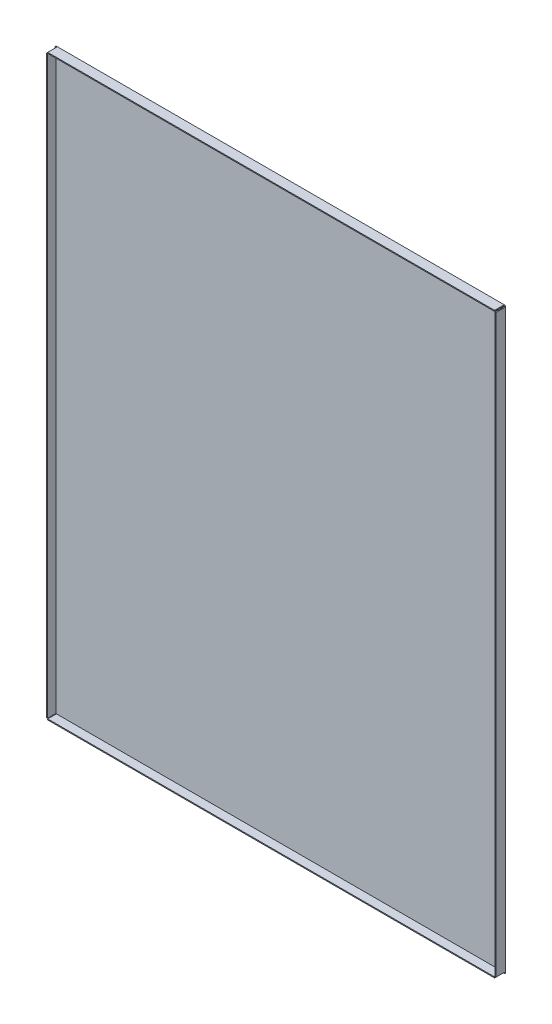
ISO-10303-21;
HEADER;
FILE_DESCRIPTION(('STEP AP214'),'2;1');
FILE_NAME('part.step','',(''),(''),'','','');
FILE_SCHEMA(('AUTOMOTIVE_DESIGN { 1 0 10303 214 1 1 1 1 }'));
ENDSEC;
DATA;
#1=APPLICATION_CONTEXT('core data for automotive mechanical design processes');
#2=APPLICATION_PROTOCOL_DEFINITION('international standard','automotive_design',2000,#1);
#3=PRODUCT_CONTEXT('',#1,'mechanical');
#4=PRODUCT('Part','Part','',(#3));
#5=PRODUCT_RELATED_PRODUCT_CATEGORY('part','',(#4));
#6=PRODUCT_DEFINITION_FORMATION('','',#4);
#7=PRODUCT_DEFINITION_CONTEXT('part definition',#1,'design');
#8=PRODUCT_DEFINITION('design','',#6,#7);
#9=PRODUCT_DEFINITION_SHAPE('','',#8);
#10=(LENGTH_UNIT() NAMED_UNIT(*) SI_UNIT(.MILLI.,.METRE.));
#11=(NAMED_UNIT(*) PLANE_ANGLE_UNIT() SI_UNIT($,.RADIAN.));
#12=(NAMED_UNIT(*) SI_UNIT($,.STERADIAN.) SOLID_ANGLE_UNIT());
#13=UNCERTAINTY_MEASURE_WITH_UNIT(LENGTH_MEASURE(1.E-05),#10,'distance_accuracy_value','');
#14=(GEOMETRIC_REPRESENTATION_CONTEXT(3) GLOBAL_UNCERTAINTY_ASSIGNED_CONTEXT((#13)) GLOBAL_UNIT_ASSIGNED_CONTEXT((#10,
#11,#12)) REPRESENTATION_CONTEXT('',''));
#15=CARTESIAN_POINT('',(0.,0.,0.));
#16=DIRECTION('',(0.,0.,1.));
#17=DIRECTION('',(1.,0.,0.));
#18=AXIS2_PLACEMENT_3D('',#15,#16,#17);
#19=CARTESIAN_POINT('',(0.,0.,15.));
#20=DIRECTION('',(0.,0.,1.));
#21=DIRECTION('',(1.,0.,0.));
#22=AXIS2_PLACEMENT_3D('',#19,#20,#21);
#23=PLANE('',#22);
#24=DIRECTION('',(1.,0.,0.));
#25=VECTOR('',#24,1.);
#26=CARTESIAN_POINT('',(349.,447.,15.));
#27=LINE('',#26,#25);
#28=CARTESIAN_POINT('',(347.5,447.,15.));
#29=VERTEX_POINT('',#28);
#30=CARTESIAN_POINT('',(349.,447.,15.));
#31=VERTEX_POINT('',#30);
#32=EDGE_CURVE('E167',#29,#31,#27,.T.);
#33=ORIENTED_EDGE('',*,*,#32,.F.);
#34=DIRECTION('',(0.,1.,0.));
#35=VECTOR('',#34,1.);
#36=CARTESIAN_POINT('',(347.5,-447.5,15.));
#37=LINE('',#36,#35);
#38=CARTESIAN_POINT('',(347.5,-447.,15.));
#39=VERTEX_POINT('',#38);
#40=EDGE_CURVE('E271',#39,#29,#37,.T.);
#41=ORIENTED_EDGE('',*,*,#40,.F.);
#42=DIRECTION('',(-1.,1.11022302462522E-13,0.));
#43=VECTOR('',#42,1.);
#44=CARTESIAN_POINT('',(349.000000000001,-447.,15.));
#45=LINE('',#44,#43);
#46=CARTESIAN_POINT('',(349.000000000001,-447.,15.));
#47=VERTEX_POINT('',#46);
#48=EDGE_CURVE('E244',#47,#39,#45,.T.);
#49=ORIENTED_EDGE('',*,*,#48,.F.);
#50=DIRECTION('',(0.,-1.,0.));
#51=VECTOR('',#50,1.);
#52=CARTESIAN_POINT('',(349.,-449.,15.));
#53=LINE('',#52,#51);
#54=EDGE_CURVE('E203',#31,#47,#53,.T.);
#55=ORIENTED_EDGE('',*,*,#54,.F.);
#56=EDGE_LOOP('',(#33,#41,#49,#55));
#57=FACE_BOUND('',#56,.T.);
#58=ADVANCED_FACE('F17',(#57),#23,.T.);
#59=DIRECTION('',(-1.,-1.11022302462516E-13,0.));
#60=VECTOR('',#59,1.);
#61=CARTESIAN_POINT('',(-349.,-447.000000000001,15.));
#62=LINE('',#61,#60);
#63=CARTESIAN_POINT('',(-347.5,-447.000000000001,15.));
#64=VERTEX_POINT('',#63);
#65=CARTESIAN_POINT('',(-349.,-447.000000000001,15.));
#66=VERTEX_POINT('',#65);
#67=EDGE_CURVE('E287',#64,#66,#62,.T.);
#68=ORIENTED_EDGE('',*,*,#67,.F.);
#69=DIRECTION('',(0.,-1.,0.));
#70=VECTOR('',#69,1.);
#71=CARTESIAN_POINT('',(-347.5,447.5,15.));
#72=LINE('',#71,#70);
#73=CARTESIAN_POINT('',(-347.5,447.,15.));
#74=VERTEX_POINT('',#73);
#75=EDGE_CURVE('E264',#74,#64,#72,.T.);
#76=ORIENTED_EDGE('',*,*,#75,.F.);
#77=DIRECTION('',(1.,-1.11022302462516E-13,0.));
#78=VECTOR('',#77,1.);
#79=CARTESIAN_POINT('',(-349.,447.,15.));
#80=LINE('',#79,#78);
#81=CARTESIAN_POINT('',(-349.,447.,15.));
#82=VERTEX_POINT('',#81);
#83=EDGE_CURVE('E307',#82,#74,#80,.T.);
#84=ORIENTED_EDGE('',*,*,#83,.F.);
#85=DIRECTION('',(0.,1.,0.));
#86=VECTOR('',#85,1.);
#87=CARTESIAN_POINT('',(-349.,-449.,15.));
#88=LINE('',#87,#86);
#89=EDGE_CURVE('E184',#66,#82,#88,.T.);
#90=ORIENTED_EDGE('',*,*,#89,.F.);
#91=EDGE_LOOP('',(#68,#76,#84,#90));
#92=FACE_BOUND('',#91,.T.);
#93=ADVANCED_FACE('F357',(#92),#23,.T.);
#94=DIRECTION('',(0.,-1.,0.));
#95=VECTOR('',#94,1.);
#96=CARTESIAN_POINT('',(347.,449.,15.));
#97=LINE('',#96,#95);
#98=CARTESIAN_POINT('',(347.,449.,15.));
#99=VERTEX_POINT('',#98);
#100=CARTESIAN_POINT('',(347.,447.5,15.));
#101=VERTEX_POINT('',#100);
#102=EDGE_CURVE('E160',#99,#101,#97,.T.);
#103=ORIENTED_EDGE('',*,*,#102,.F.);
#104=DIRECTION('',(1.,0.,0.));
#105=VECTOR('',#104,1.);
#106=CARTESIAN_POINT('',(349.,449.,15.));
#107=LINE('',#106,#105);
#108=CARTESIAN_POINT('',(-347.,449.,15.));
#109=VERTEX_POINT('',#108);
#110=EDGE_CURVE('E174',#109,#99,#107,.T.);
#111=ORIENTED_EDGE('',*,*,#110,.F.);
#112=DIRECTION('',(0.,1.,0.));
#113=VECTOR('',#112,1.);
#114=CARTESIAN_POINT('',(-347.,449.,15.));
#115=LINE('',#114,#113);
#116=CARTESIAN_POINT('',(-347.,447.5,15.));
#117=VERTEX_POINT('',#116);
#118=EDGE_CURVE('E309',#117,#109,#115,.T.);
#119=ORIENTED_EDGE('',*,*,#118,.F.);
#120=DIRECTION('',(-1.,0.,0.));
#121=VECTOR('',#120,1.);
#122=CARTESIAN_POINT('',(347.5,447.5,15.));
#123=LINE('',#122,#121);
#124=EDGE_CURVE('E176',#101,#117,#123,.T.);
#125=ORIENTED_EDGE('',*,*,#124,.F.);
#126=EDGE_LOOP('',(#103,#111,#119,#125));
#127=FACE_BOUND('',#126,.T.);
#128=ADVANCED_FACE('F172',(#127),#23,.T.);
#129=CARTESIAN_POINT('',(349.,-449.,15.));
#130=DIRECTION('',(1.,0.,0.));
#131=DIRECTION('',(0.,1.,0.));
#132=AXIS2_PLACEMENT_3D('',#129,#130,#131);
#133=PLANE('',#132);
#134=DIRECTION('',(0.,0.,1.));
#135=VECTOR('',#134,1.);
#136=CARTESIAN_POINT('',(349.,447.,-1.32842712474682));
#137=LINE('',#136,#135);
#138=CARTESIAN_POINT('',(349.,447.,1.5));
#139=VERTEX_POINT('',#138);
#140=EDGE_CURVE('E166',#139,#31,#137,.T.);
#141=ORIENTED_EDGE('',*,*,#140,.T.);
#142=ORIENTED_EDGE('',*,*,#54,.T.);
#143=DIRECTION('',(0.,0.,1.));
#144=VECTOR('',#143,1.);
#145=CARTESIAN_POINT('',(349.000000000001,-447.,-1.32842712474682));
#146=LINE('',#145,#144);
#147=CARTESIAN_POINT('',(349.000000000001,-447.,1.5));
#148=VERTEX_POINT('',#147);
#149=EDGE_CURVE('E249',#148,#47,#146,.T.);
#150=ORIENTED_EDGE('',*,*,#149,.F.);
#151=DIRECTION('',(-3.88578058618804E-13,-1.,0.));
#152=VECTOR('',#151,1.);
#153=CARTESIAN_POINT('',(349.,-449.,1.5));
#154=LINE('',#153,#152);
#155=CARTESIAN_POINT('',(349.,-449.,1.5));
#156=VERTEX_POINT('',#155);
#157=EDGE_CURVE('E228',#148,#156,#154,.T.);
#158=ORIENTED_EDGE('',*,*,#157,.T.);
#159=DIRECTION('',(0.,0.,-1.));
#160=VECTOR('',#159,1.);
#161=CARTESIAN_POINT('',(349.,-449.,15.));
#162=LINE('',#161,#160);
#163=CARTESIAN_POINT('',(349.,-449.,0.));
#164=VERTEX_POINT('',#163);
#165=EDGE_CURVE('E21',#156,#164,#162,.T.);
#166=ORIENTED_EDGE('',*,*,#165,.T.);
#167=DIRECTION('',(0.,-1.,0.));
#168=VECTOR('',#167,1.);
#169=CARTESIAN_POINT('',(349.,-449.,0.));
#170=LINE('',#169,#168);
#171=CARTESIAN_POINT('',(349.,449.,0.));
#172=VERTEX_POINT('',#171);
#173=EDGE_CURVE('E192',#172,#164,#170,.T.);
#174=ORIENTED_EDGE('',*,*,#173,.F.);
#175=DIRECTION('',(0.,0.,-1.));
#176=VECTOR('',#175,1.);
#177=CARTESIAN_POINT('',(349.,449.,15.));
#178=LINE('',#177,#176);
#179=CARTESIAN_POINT('',(349.,449.,1.5));
#180=VERTEX_POINT('',#179);
#181=EDGE_CURVE('E11',#180,#172,#178,.T.);
#182=ORIENTED_EDGE('',*,*,#181,.F.);
#183=DIRECTION('',(0.,-1.,0.));
#184=VECTOR('',#183,1.);
#185=CARTESIAN_POINT('',(349.,449.,1.5));
#186=LINE('',#185,#184);
#187=EDGE_CURVE('E345',#180,#139,#186,.T.);
#188=ORIENTED_EDGE('',*,*,#187,.T.);
#189=EDGE_LOOP('',(#141,#142,#150,#158,#166,#174,#182,#188));
#190=FACE_BOUND('',#189,.T.);
#191=ADVANCED_FACE('F19',(#190),#133,.T.);
#192=CARTESIAN_POINT('',(349.,449.,15.));
#193=DIRECTION('',(0.,1.,0.));
#194=DIRECTION('',(-1.,0.,0.));
#195=AXIS2_PLACEMENT_3D('',#192,#193,#194);
#196=PLANE('',#195);
#197=DIRECTION('',(0.,0.,1.));
#198=VECTOR('',#197,1.);
#199=CARTESIAN_POINT('',(347.,449.,-1.32842712474682));
#200=LINE('',#199,#198);
#201=CARTESIAN_POINT('',(347.,449.,1.5));
#202=VERTEX_POINT('',#201);
#203=EDGE_CURVE('E157',#202,#99,#200,.T.);
#204=ORIENTED_EDGE('',*,*,#203,.F.);
#205=DIRECTION('',(1.,0.,0.));
#206=VECTOR('',#205,1.);
#207=CARTESIAN_POINT('',(349.,449.,1.5));
#208=LINE('',#207,#206);
#209=EDGE_CURVE('E318',#202,#180,#208,.T.);
#210=ORIENTED_EDGE('',*,*,#209,.T.);
#211=ORIENTED_EDGE('',*,*,#181,.T.);
#212=DIRECTION('',(1.,0.,0.));
#213=VECTOR('',#212,1.);
#214=CARTESIAN_POINT('',(349.,449.,0.));
#215=LINE('',#214,#213);
#216=CARTESIAN_POINT('',(-349.,449.,0.));
#217=VERTEX_POINT('',#216);
#218=EDGE_CURVE('E201',#217,#172,#215,.T.);
#219=ORIENTED_EDGE('',*,*,#218,.F.);
#220=DIRECTION('',(0.,0.,-1.));
#221=VECTOR('',#220,1.);
#222=CARTESIAN_POINT('',(-349.,449.,15.));
#223=LINE('',#222,#221);
#224=CARTESIAN_POINT('',(-349.,449.,1.5));
#225=VERTEX_POINT('',#224);
#226=EDGE_CURVE('E26',#225,#217,#223,.T.);
#227=ORIENTED_EDGE('',*,*,#226,.F.);
#228=DIRECTION('',(1.,0.,0.));
#229=VECTOR('',#228,1.);
#230=CARTESIAN_POINT('',(-349.,449.,1.5));
#231=LINE('',#230,#229);
#232=CARTESIAN_POINT('',(-347.,449.,1.5));
#233=VERTEX_POINT('',#232);
#234=EDGE_CURVE('E304',#225,#233,#231,.T.);
#235=ORIENTED_EDGE('',*,*,#234,.T.);
#236=DIRECTION('',(0.,0.,1.));
#237=VECTOR('',#236,1.);
#238=CARTESIAN_POINT('',(-347.,449.,-1.32842712474682));
#239=LINE('',#238,#237);
#240=EDGE_CURVE('E183',#233,#109,#239,.T.);
#241=ORIENTED_EDGE('',*,*,#240,.T.);
#242=ORIENTED_EDGE('',*,*,#110,.T.);
#243=EDGE_LOOP('',(#204,#210,#211,#219,#227,#235,#241,#242));
#244=FACE_BOUND('',#243,.T.);
#245=ADVANCED_FACE('F180',(#244),#196,.T.);
#246=CARTESIAN_POINT('',(-349.,-449.,15.));
#247=DIRECTION('',(-1.,0.,0.));
#248=DIRECTION('',(0.,0.,1.));
#249=AXIS2_PLACEMENT_3D('',#246,#247,#248);
#250=PLANE('',#249);
#251=DIRECTION('',(0.,0.,1.));
#252=VECTOR('',#251,1.);
#253=CARTESIAN_POINT('',(-349.,-447.000000000001,-1.32842712474682));
#254=LINE('',#253,#252);
#255=CARTESIAN_POINT('',(-349.,-447.000000000001,1.5));
#256=VERTEX_POINT('',#255);
#257=EDGE_CURVE('E297',#256,#66,#254,.T.);
#258=ORIENTED_EDGE('',*,*,#257,.T.);
#259=ORIENTED_EDGE('',*,*,#89,.T.);
#260=DIRECTION('',(0.,0.,1.));
#261=VECTOR('',#260,1.);
#262=CARTESIAN_POINT('',(-349.,447.,-1.32842712474682));
#263=LINE('',#262,#261);
#264=CARTESIAN_POINT('',(-349.,447.,1.5));
#265=VERTEX_POINT('',#264);
#266=EDGE_CURVE('E311',#265,#82,#263,.T.);
#267=ORIENTED_EDGE('',*,*,#266,.F.);
#268=DIRECTION('',(0.,1.,0.));
#269=VECTOR('',#268,1.);
#270=CARTESIAN_POINT('',(-349.,449.,1.5));
#271=LINE('',#270,#269);
#272=EDGE_CURVE('E291',#265,#225,#271,.T.);
#273=ORIENTED_EDGE('',*,*,#272,.T.);
#274=ORIENTED_EDGE('',*,*,#226,.T.);
#275=DIRECTION('',(0.,1.,0.));
#276=VECTOR('',#275,1.);
#277=CARTESIAN_POINT('',(-349.,-449.,0.));
#278=LINE('',#277,#276);
#279=CARTESIAN_POINT('',(-349.,-449.,0.));
#280=VERTEX_POINT('',#279);
#281=EDGE_CURVE('E198',#280,#217,#278,.T.);
#282=ORIENTED_EDGE('',*,*,#281,.F.);
#283=DIRECTION('',(0.,0.,-1.));
#284=VECTOR('',#283,1.);
#285=CARTESIAN_POINT('',(-349.,-449.,15.));
#286=LINE('',#285,#284);
#287=CARTESIAN_POINT('',(-349.,-449.,1.5));
#288=VERTEX_POINT('',#287);
#289=EDGE_CURVE('E186',#288,#280,#286,.T.);
#290=ORIENTED_EDGE('',*,*,#289,.F.);
#291=DIRECTION('',(3.33066907387732E-13,1.,0.));
#292=VECTOR('',#291,1.);
#293=CARTESIAN_POINT('',(-349.,-449.,1.5));
#294=LINE('',#293,#292);
#295=EDGE_CURVE('E294',#288,#256,#294,.T.);
#296=ORIENTED_EDGE('',*,*,#295,.T.);
#297=EDGE_LOOP('',(#258,#259,#267,#273,#274,#282,#290,#296));
#298=FACE_BOUND('',#297,.T.);
#299=ADVANCED_FACE('F217',(#298),#250,.T.);
#300=CARTESIAN_POINT('',(349.,-449.,15.));
#301=DIRECTION('',(0.,-1.,0.));
#302=DIRECTION('',(0.,0.,-1.));
#303=AXIS2_PLACEMENT_3D('',#300,#301,#302);
#304=PLANE('',#303);
#305=DIRECTION('',(0.,0.,1.));
#306=VECTOR('',#305,1.);
#307=CARTESIAN_POINT('',(-347.,-449.000000000001,-1.32842712474682));
#308=LINE('',#307,#306);
#309=CARTESIAN_POINT('',(-347.,-449.000000000001,1.5));
#310=VERTEX_POINT('',#309);
#311=CARTESIAN_POINT('',(-347.,-449.000000000001,15.));
#312=VERTEX_POINT('',#311);
#313=EDGE_CURVE('E278',#310,#312,#308,.T.);
#314=ORIENTED_EDGE('',*,*,#313,.F.);
#315=DIRECTION('',(-1.,5.55111512312393E-13,0.));
#316=VECTOR('',#315,1.);
#317=CARTESIAN_POINT('',(-349.,-449.,1.5));
#318=LINE('',#317,#316);
#319=EDGE_CURVE('E177',#310,#288,#318,.T.);
#320=ORIENTED_EDGE('',*,*,#319,.T.);
#321=ORIENTED_EDGE('',*,*,#289,.T.);
#322=DIRECTION('',(-1.,0.,0.));
#323=VECTOR('',#322,1.);
#324=CARTESIAN_POINT('',(349.,-449.,0.));
#325=LINE('',#324,#323);
#326=EDGE_CURVE('E195',#164,#280,#325,.T.);
#327=ORIENTED_EDGE('',*,*,#326,.F.);
#328=ORIENTED_EDGE('',*,*,#165,.F.);
#329=DIRECTION('',(-1.,0.,0.));
#330=VECTOR('',#329,1.);
#331=CARTESIAN_POINT('',(349.,-449.,1.5));
#332=LINE('',#331,#330);
#333=CARTESIAN_POINT('',(347.000000000001,-449.,1.5));
#334=VERTEX_POINT('',#333);
#335=EDGE_CURVE('E231',#156,#334,#332,.T.);
#336=ORIENTED_EDGE('',*,*,#335,.T.);
#337=DIRECTION('',(0.,0.,1.));
#338=VECTOR('',#337,1.);
#339=CARTESIAN_POINT('',(347.000000000001,-449.,-1.32842712474682));
#340=LINE('',#339,#338);
#341=CARTESIAN_POINT('',(347.000000000001,-449.,15.));
#342=VERTEX_POINT('',#341);
#343=EDGE_CURVE('E234',#334,#342,#340,.T.);
#344=ORIENTED_EDGE('',*,*,#343,.T.);
#345=DIRECTION('',(-1.,0.,0.));
#346=VECTOR('',#345,1.);
#347=CARTESIAN_POINT('',(349.,-449.,15.));
#348=LINE('',#347,#346);
#349=EDGE_CURVE('E188',#342,#312,#348,.T.);
#350=ORIENTED_EDGE('',*,*,#349,.T.);
#351=EDGE_LOOP('',(#314,#320,#321,#327,#328,#336,#344,#350));
#352=FACE_BOUND('',#351,.T.);
#353=ADVANCED_FACE('F211',(#352),#304,.T.);
#354=DIRECTION('',(0.,1.,0.));
#355=VECTOR('',#354,1.);
#356=CARTESIAN_POINT('',(-347.,-449.000000000001,15.));
#357=LINE('',#356,#355);
#358=CARTESIAN_POINT('',(-347.,-447.5,15.));
#359=VERTEX_POINT('',#358);
#360=EDGE_CURVE('E284',#312,#359,#357,.T.);
#361=ORIENTED_EDGE('',*,*,#360,.F.);
#362=ORIENTED_EDGE('',*,*,#349,.F.);
#363=DIRECTION('',(0.,-1.,0.));
#364=VECTOR('',#363,1.);
#365=CARTESIAN_POINT('',(347.000000000001,-449.,15.));
#366=LINE('',#365,#364);
#367=CARTESIAN_POINT('',(347.000000000001,-447.5,15.));
#368=VERTEX_POINT('',#367);
#369=EDGE_CURVE('E246',#368,#342,#366,.T.);
#370=ORIENTED_EDGE('',*,*,#369,.F.);
#371=DIRECTION('',(1.,0.,0.));
#372=VECTOR('',#371,1.);
#373=CARTESIAN_POINT('',(-347.5,-447.5,15.));
#374=LINE('',#373,#372);
#375=EDGE_CURVE('E259',#359,#368,#374,.T.);
#376=ORIENTED_EDGE('',*,*,#375,.F.);
#377=EDGE_LOOP('',(#361,#362,#370,#376));
#378=FACE_BOUND('',#377,.T.);
#379=ADVANCED_FACE('F282',(#378),#23,.T.);
#380=CARTESIAN_POINT('',(0.,0.,0.));
#381=DIRECTION('',(0.,0.,1.));
#382=DIRECTION('',(1.,0.,0.));
#383=AXIS2_PLACEMENT_3D('',#380,#381,#382);
#384=PLANE('',#383);
#385=ORIENTED_EDGE('',*,*,#173,.T.);
#386=ORIENTED_EDGE('',*,*,#326,.T.);
#387=ORIENTED_EDGE('',*,*,#281,.T.);
#388=ORIENTED_EDGE('',*,*,#218,.T.);
#389=EDGE_LOOP('',(#385,#386,#387,#388));
#390=FACE_BOUND('',#389,.T.);
#391=ADVANCED_FACE('F221',(#390),#384,.F.);
#392=CARTESIAN_POINT('',(-347.5,-447.5,-1133.15930036337));
#393=DIRECTION('',(0.,-1.,0.));
#394=DIRECTION('',(1.,0.,0.));
#395=AXIS2_PLACEMENT_3D('',#392,#393,#394);
#396=PLANE('',#395);
#397=DIRECTION('',(-1.,0.,0.));
#398=VECTOR('',#397,1.);
#399=CARTESIAN_POINT('',(-347.5,-447.5,1.50000000000006));
#400=LINE('',#399,#398);
#401=CARTESIAN_POINT('',(347.000000000001,-447.5,1.5));
#402=VERTEX_POINT('',#401);
#403=CARTESIAN_POINT('',(-347.,-447.5,1.5));
#404=VERTEX_POINT('',#403);
#405=EDGE_CURVE('E267',#402,#404,#400,.T.);
#406=ORIENTED_EDGE('',*,*,#405,.T.);
#407=DIRECTION('',(0.,0.,1.));
#408=VECTOR('',#407,1.);
#409=CARTESIAN_POINT('',(-347.,-447.5,-1133.15930036337));
#410=LINE('',#409,#408);
#411=EDGE_CURVE('E321',#404,#359,#410,.T.);
#412=ORIENTED_EDGE('',*,*,#411,.T.);
#413=ORIENTED_EDGE('',*,*,#375,.T.);
#414=DIRECTION('',(0.,0.,-1.));
#415=VECTOR('',#414,1.);
#416=CARTESIAN_POINT('',(347.000000000001,-447.5,-1133.15930036337));
#417=LINE('',#416,#415);
#418=EDGE_CURVE('E256',#368,#402,#417,.T.);
#419=ORIENTED_EDGE('',*,*,#418,.T.);
#420=EDGE_LOOP('',(#406,#412,#413,#419));
#421=FACE_BOUND('',#420,.T.);
#422=ADVANCED_FACE('F395',(#421),#396,.F.);
#423=CARTESIAN_POINT('',(-347.5,447.5,-1133.15930036337));
#424=DIRECTION('',(-1.,0.,0.));
#425=DIRECTION('',(0.,0.,1.));
#426=AXIS2_PLACEMENT_3D('',#423,#424,#425);
#427=PLANE('',#426);
#428=ORIENTED_EDGE('',*,*,#75,.T.);
#429=DIRECTION('',(0.,0.,-1.));
#430=VECTOR('',#429,1.);
#431=CARTESIAN_POINT('',(-347.5,-447.000000000001,-1133.15930036337));
#432=LINE('',#431,#430);
#433=CARTESIAN_POINT('',(-347.5,-447.000000000001,1.5));
#434=VERTEX_POINT('',#433);
#435=EDGE_CURVE('E323',#64,#434,#432,.T.);
#436=ORIENTED_EDGE('',*,*,#435,.T.);
#437=DIRECTION('',(0.,1.,0.));
#438=VECTOR('',#437,1.);
#439=CARTESIAN_POINT('',(-347.5,447.5,1.50000000000006));
#440=LINE('',#439,#438);
#441=CARTESIAN_POINT('',(-347.5,447.,1.5));
#442=VERTEX_POINT('',#441);
#443=EDGE_CURVE('E263',#434,#442,#440,.T.);
#444=ORIENTED_EDGE('',*,*,#443,.T.);
#445=DIRECTION('',(0.,0.,1.));
#446=VECTOR('',#445,1.);
#447=CARTESIAN_POINT('',(-347.5,447.,-1133.15930036337));
#448=LINE('',#447,#446);
#449=EDGE_CURVE('E314',#442,#74,#448,.T.);
#450=ORIENTED_EDGE('',*,*,#449,.T.);
#451=EDGE_LOOP('',(#428,#436,#444,#450));
#452=FACE_BOUND('',#451,.T.);
#453=ADVANCED_FACE('F360',(#452),#427,.F.);
#454=CARTESIAN_POINT('',(347.5,447.5,-1133.15930036337));
#455=DIRECTION('',(0.,1.,0.));
#456=DIRECTION('',(-1.,0.,0.));
#457=AXIS2_PLACEMENT_3D('',#454,#455,#456);
#458=PLANE('',#457);
#459=DIRECTION('',(1.,0.,0.));
#460=VECTOR('',#459,1.);
#461=CARTESIAN_POINT('',(347.5,447.5,1.50000000000006));
#462=LINE('',#461,#460);
#463=CARTESIAN_POINT('',(-347.,447.5,1.5));
#464=VERTEX_POINT('',#463);
#465=CARTESIAN_POINT('',(347.,447.5,1.5));
#466=VERTEX_POINT('',#465);
#467=EDGE_CURVE('E260',#464,#466,#462,.T.);
#468=ORIENTED_EDGE('',*,*,#467,.T.);
#469=DIRECTION('',(0.,0.,1.));
#470=VECTOR('',#469,1.);
#471=CARTESIAN_POINT('',(347.,447.5,-1133.15930036337));
#472=LINE('',#471,#470);
#473=EDGE_CURVE('E326',#466,#101,#472,.T.);
#474=ORIENTED_EDGE('',*,*,#473,.T.);
#475=ORIENTED_EDGE('',*,*,#124,.T.);
#476=DIRECTION('',(0.,0.,-1.));
#477=VECTOR('',#476,1.);
#478=CARTESIAN_POINT('',(-347.,447.5,-1133.15930036337));
#479=LINE('',#478,#477);
#480=EDGE_CURVE('E317',#117,#464,#479,.T.);
#481=ORIENTED_EDGE('',*,*,#480,.T.);
#482=EDGE_LOOP('',(#468,#474,#475,#481));
#483=FACE_BOUND('',#482,.T.);
#484=ADVANCED_FACE('F369',(#483),#458,.F.);
#485=CARTESIAN_POINT('',(347.5,-447.5,-1133.15930036337));
#486=DIRECTION('',(1.,0.,0.));
#487=DIRECTION('',(0.,1.,0.));
#488=AXIS2_PLACEMENT_3D('',#485,#486,#487);
#489=PLANE('',#488);
#490=ORIENTED_EDGE('',*,*,#40,.T.);
#491=DIRECTION('',(0.,0.,-1.));
#492=VECTOR('',#491,1.);
#493=CARTESIAN_POINT('',(347.5,447.,-1133.15930036337));
#494=LINE('',#493,#492);
#495=CARTESIAN_POINT('',(347.5,447.,1.5));
#496=VERTEX_POINT('',#495);
#497=EDGE_CURVE('E247',#29,#496,#494,.T.);
#498=ORIENTED_EDGE('',*,*,#497,.T.);
#499=DIRECTION('',(0.,-1.,0.));
#500=VECTOR('',#499,1.);
#501=CARTESIAN_POINT('',(347.5,-447.5,1.50000000000006));
#502=LINE('',#501,#500);
#503=CARTESIAN_POINT('',(347.5,-447.,1.50000000000006));
#504=VERTEX_POINT('',#503);
#505=EDGE_CURVE('E34',#496,#504,#502,.T.);
#506=ORIENTED_EDGE('',*,*,#505,.T.);
#507=DIRECTION('',(0.,0.,1.));
#508=VECTOR('',#507,1.);
#509=CARTESIAN_POINT('',(347.5,-447.,-1133.15930036337));
#510=LINE('',#509,#508);
#511=EDGE_CURVE('E254',#504,#39,#510,.T.);
#512=ORIENTED_EDGE('',*,*,#511,.T.);
#513=EDGE_LOOP('',(#490,#498,#506,#512));
#514=FACE_BOUND('',#513,.T.);
#515=ADVANCED_FACE('F327',(#514),#489,.F.);
#516=CARTESIAN_POINT('',(0.,0.,1.5));
#517=DIRECTION('',(0.,0.,1.));
#518=DIRECTION('',(1.,0.,0.));
#519=AXIS2_PLACEMENT_3D('',#516,#517,#518);
#520=PLANE('',#519);
#521=ORIENTED_EDGE('',*,*,#505,.F.);
#522=DIRECTION('',(-1.,0.,0.));
#523=VECTOR('',#522,1.);
#524=CARTESIAN_POINT('',(349.,447.,1.5));
#525=LINE('',#524,#523);
#526=EDGE_CURVE('E332',#139,#496,#525,.T.);
#527=ORIENTED_EDGE('',*,*,#526,.F.);
#528=ORIENTED_EDGE('',*,*,#187,.F.);
#529=ORIENTED_EDGE('',*,*,#209,.F.);
#530=DIRECTION('',(0.,1.,0.));
#531=VECTOR('',#530,1.);
#532=CARTESIAN_POINT('',(347.,449.,1.5));
#533=LINE('',#532,#531);
#534=EDGE_CURVE('E163',#466,#202,#533,.T.);
#535=ORIENTED_EDGE('',*,*,#534,.F.);
#536=ORIENTED_EDGE('',*,*,#467,.F.);
#537=DIRECTION('',(0.,-1.,0.));
#538=VECTOR('',#537,1.);
#539=CARTESIAN_POINT('',(-347.,449.,1.5));
#540=LINE('',#539,#538);
#541=EDGE_CURVE('E302',#233,#464,#540,.T.);
#542=ORIENTED_EDGE('',*,*,#541,.F.);
#543=ORIENTED_EDGE('',*,*,#234,.F.);
#544=ORIENTED_EDGE('',*,*,#272,.F.);
#545=DIRECTION('',(-1.,1.11022302462516E-13,0.));
#546=VECTOR('',#545,1.);
#547=CARTESIAN_POINT('',(-349.,447.,1.5));
#548=LINE('',#547,#546);
#549=EDGE_CURVE('E288',#442,#265,#548,.T.);
#550=ORIENTED_EDGE('',*,*,#549,.F.);
#551=ORIENTED_EDGE('',*,*,#443,.F.);
#552=DIRECTION('',(1.,1.11022302462516E-13,0.));
#553=VECTOR('',#552,1.);
#554=CARTESIAN_POINT('',(-349.,-447.000000000001,1.5));
#555=LINE('',#554,#553);
#556=EDGE_CURVE('E346',#256,#434,#555,.T.);
#557=ORIENTED_EDGE('',*,*,#556,.F.);
#558=ORIENTED_EDGE('',*,*,#295,.F.);
#559=ORIENTED_EDGE('',*,*,#319,.F.);
#560=DIRECTION('',(0.,-1.,0.));
#561=VECTOR('',#560,1.);
#562=CARTESIAN_POINT('',(-347.,-449.000000000001,1.5));
#563=LINE('',#562,#561);
#564=EDGE_CURVE('E299',#404,#310,#563,.T.);
#565=ORIENTED_EDGE('',*,*,#564,.F.);
#566=ORIENTED_EDGE('',*,*,#405,.F.);
#567=DIRECTION('',(0.,1.,0.));
#568=VECTOR('',#567,1.);
#569=CARTESIAN_POINT('',(347.000000000001,-449.,1.5));
#570=LINE('',#569,#568);
#571=EDGE_CURVE('E237',#334,#402,#570,.T.);
#572=ORIENTED_EDGE('',*,*,#571,.F.);
#573=ORIENTED_EDGE('',*,*,#335,.F.);
#574=ORIENTED_EDGE('',*,*,#157,.F.);
#575=DIRECTION('',(1.,-1.11022302462522E-13,0.));
#576=VECTOR('',#575,1.);
#577=CARTESIAN_POINT('',(349.000000000001,-447.,1.5));
#578=LINE('',#577,#576);
#579=EDGE_CURVE('E239',#504,#148,#578,.T.);
#580=ORIENTED_EDGE('',*,*,#579,.F.);
#581=EDGE_LOOP('',(#521,#527,#528,#529,#535,#536,#542,#543,#544,#550,#551,#557,#558,#559,#565,
#566,#572,#573,#574,#580));
#582=FACE_BOUND('',#581,.T.);
#583=ADVANCED_FACE('F331',(#582),#520,.T.);
#584=CARTESIAN_POINT('',(347.000000000001,-449.,-1.32842712474682));
#585=DIRECTION('',(-1.,0.,0.));
#586=DIRECTION('',(0.,0.,1.));
#587=AXIS2_PLACEMENT_3D('',#584,#585,#586);
#588=PLANE('',#587);
#589=ORIENTED_EDGE('',*,*,#369,.T.);
#590=ORIENTED_EDGE('',*,*,#343,.F.);
#591=ORIENTED_EDGE('',*,*,#571,.T.);
#592=ORIENTED_EDGE('',*,*,#418,.F.);
#593=EDGE_LOOP('',(#589,#590,#591,#592));
#594=FACE_BOUND('',#593,.T.);
#595=ADVANCED_FACE('F381',(#594),#588,.F.);
#596=CARTESIAN_POINT('',(349.000000000001,-447.,-1.32842712474682));
#597=DIRECTION('',(1.11022302462522E-13,1.,0.));
#598=DIRECTION('',(-1.,1.11022302462522E-13,0.));
#599=AXIS2_PLACEMENT_3D('',#596,#597,#598);
#600=PLANE('',#599);
#601=ORIENTED_EDGE('',*,*,#579,.T.);
#602=ORIENTED_EDGE('',*,*,#149,.T.);
#603=ORIENTED_EDGE('',*,*,#48,.T.);
#604=ORIENTED_EDGE('',*,*,#511,.F.);
#605=EDGE_LOOP('',(#601,#602,#603,#604));
#606=FACE_BOUND('',#605,.T.);
#607=ADVANCED_FACE('F336',(#606),#600,.F.);
#608=CARTESIAN_POINT('',(349.,447.,-1.32842712474682));
#609=DIRECTION('',(0.,-1.,0.));
#610=DIRECTION('',(1.,0.,0.));
#611=AXIS2_PLACEMENT_3D('',#608,#609,#610);
#612=PLANE('',#611);
#613=ORIENTED_EDGE('',*,*,#32,.T.);
#614=ORIENTED_EDGE('',*,*,#140,.F.);
#615=ORIENTED_EDGE('',*,*,#526,.T.);
#616=ORIENTED_EDGE('',*,*,#497,.F.);
#617=EDGE_LOOP('',(#613,#614,#615,#616));
#618=FACE_BOUND('',#617,.T.);
#619=ADVANCED_FACE('F372',(#618),#612,.F.);
#620=CARTESIAN_POINT('',(347.,449.,-1.32842712474682));
#621=DIRECTION('',(-1.,0.,0.));
#622=DIRECTION('',(0.,0.,1.));
#623=AXIS2_PLACEMENT_3D('',#620,#621,#622);
#624=PLANE('',#623);
#625=ORIENTED_EDGE('',*,*,#534,.T.);
#626=ORIENTED_EDGE('',*,*,#203,.T.);
#627=ORIENTED_EDGE('',*,*,#102,.T.);
#628=ORIENTED_EDGE('',*,*,#473,.F.);
#629=EDGE_LOOP('',(#625,#626,#627,#628));
#630=FACE_BOUND('',#629,.T.);
#631=ADVANCED_FACE('F159',(#630),#624,.F.);
#632=CARTESIAN_POINT('',(-347.,449.,-1.32842712474682));
#633=DIRECTION('',(1.,0.,0.));
#634=DIRECTION('',(0.,0.,-1.));
#635=AXIS2_PLACEMENT_3D('',#632,#633,#634);
#636=PLANE('',#635);
#637=ORIENTED_EDGE('',*,*,#118,.T.);
#638=ORIENTED_EDGE('',*,*,#240,.F.);
#639=ORIENTED_EDGE('',*,*,#541,.T.);
#640=ORIENTED_EDGE('',*,*,#480,.F.);
#641=EDGE_LOOP('',(#637,#638,#639,#640));
#642=FACE_BOUND('',#641,.T.);
#643=ADVANCED_FACE('F367',(#642),#636,.F.);
#644=CARTESIAN_POINT('',(-349.,447.,-1.32842712474682));
#645=DIRECTION('',(-1.11022302462516E-13,-1.,0.));
#646=DIRECTION('',(1.,-1.11022302462516E-13,0.));
#647=AXIS2_PLACEMENT_3D('',#644,#645,#646);
#648=PLANE('',#647);
#649=ORIENTED_EDGE('',*,*,#549,.T.);
#650=ORIENTED_EDGE('',*,*,#266,.T.);
#651=ORIENTED_EDGE('',*,*,#83,.T.);
#652=ORIENTED_EDGE('',*,*,#449,.F.);
#653=EDGE_LOOP('',(#649,#650,#651,#652));
#654=FACE_BOUND('',#653,.T.);
#655=ADVANCED_FACE('F362',(#654),#648,.F.);
#656=CARTESIAN_POINT('',(-349.,-447.000000000001,-1.32842712474682));
#657=DIRECTION('',(-1.11022302462516E-13,1.,0.));
#658=DIRECTION('',(-1.,-1.11022302462516E-13,0.));
#659=AXIS2_PLACEMENT_3D('',#656,#657,#658);
#660=PLANE('',#659);
#661=ORIENTED_EDGE('',*,*,#67,.T.);
#662=ORIENTED_EDGE('',*,*,#257,.F.);
#663=ORIENTED_EDGE('',*,*,#556,.T.);
#664=ORIENTED_EDGE('',*,*,#435,.F.);
#665=EDGE_LOOP('',(#661,#662,#663,#664));
#666=FACE_BOUND('',#665,.T.);
#667=ADVANCED_FACE('F353',(#666),#660,.F.);
#668=CARTESIAN_POINT('',(-347.,-449.000000000001,-1.32842712474682));
#669=DIRECTION('',(1.,0.,0.));
#670=DIRECTION('',(0.,0.,-1.));
#671=AXIS2_PLACEMENT_3D('',#668,#669,#670);
#672=PLANE('',#671);
#673=ORIENTED_EDGE('',*,*,#564,.T.);
#674=ORIENTED_EDGE('',*,*,#313,.T.);
#675=ORIENTED_EDGE('',*,*,#360,.T.);
#676=ORIENTED_EDGE('',*,*,#411,.F.);
#677=EDGE_LOOP('',(#673,#674,#675,#676));
#678=FACE_BOUND('',#677,.T.);
#679=ADVANCED_FACE('F525',(#678),#672,.F.);
#680=CLOSED_SHELL('',(#58,#93,#128,#191,#245,#299,#353,#379,#391,#422,#453,#484,#515,#583,#595,
#607,#619,#631,#643,#655,#667,#679));
#681=MANIFOLD_SOLID_BREP('B1',#680);
#682=ADVANCED_BREP_SHAPE_REPRESENTATION('',(#18,#681),#14);
#683=SHAPE_DEFINITION_REPRESENTATION(#9,#682);
ENDSEC;
END-ISO-10303-21;
